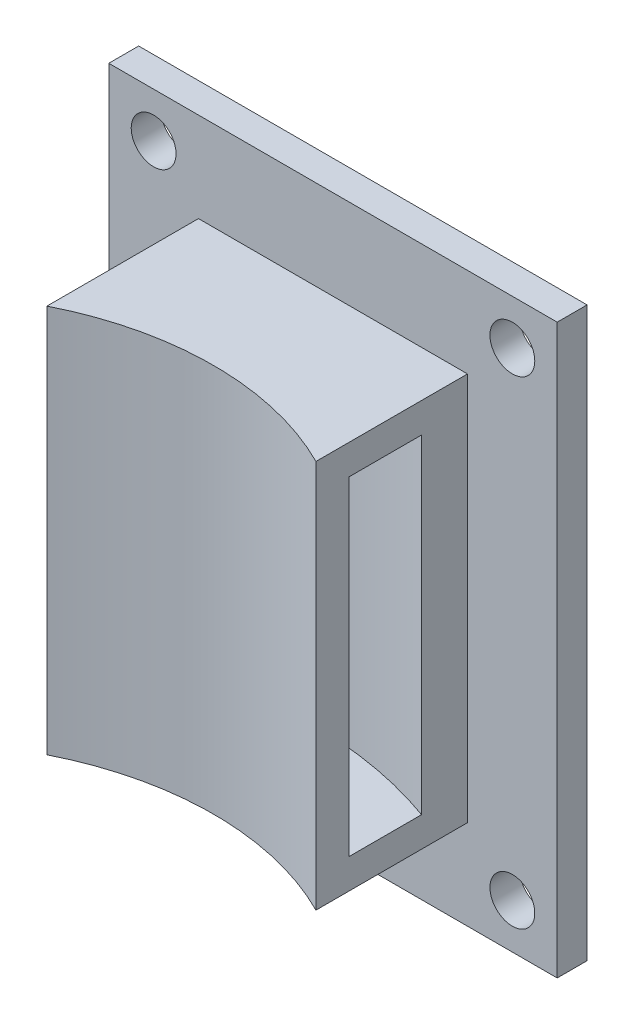
ISO-10303-21;
HEADER;
FILE_DESCRIPTION(('STEP AP214'),'2;1');
FILE_NAME('part.step','',(''),(''),'','','');
FILE_SCHEMA(('AUTOMOTIVE_DESIGN { 1 0 10303 214 1 1 1 1 }'));
ENDSEC;
DATA;
#1=APPLICATION_CONTEXT('core data for automotive mechanical design processes');
#2=APPLICATION_PROTOCOL_DEFINITION('international standard','automotive_design',2000,#1);
#3=PRODUCT_CONTEXT('',#1,'mechanical');
#4=PRODUCT('Part','Part','',(#3));
#5=PRODUCT_RELATED_PRODUCT_CATEGORY('part','',(#4));
#6=PRODUCT_DEFINITION_FORMATION('','',#4);
#7=PRODUCT_DEFINITION_CONTEXT('part definition',#1,'design');
#8=PRODUCT_DEFINITION('design','',#6,#7);
#9=PRODUCT_DEFINITION_SHAPE('','',#8);
#10=(LENGTH_UNIT() NAMED_UNIT(*) SI_UNIT(.MILLI.,.METRE.));
#11=(NAMED_UNIT(*) PLANE_ANGLE_UNIT() SI_UNIT($,.RADIAN.));
#12=(NAMED_UNIT(*) SI_UNIT($,.STERADIAN.) SOLID_ANGLE_UNIT());
#13=UNCERTAINTY_MEASURE_WITH_UNIT(LENGTH_MEASURE(1.E-05),#10,'distance_accuracy_value','');
#14=(GEOMETRIC_REPRESENTATION_CONTEXT(3) GLOBAL_UNCERTAINTY_ASSIGNED_CONTEXT((#13)) GLOBAL_UNIT_ASSIGNED_CONTEXT((#10,
#11,#12)) REPRESENTATION_CONTEXT('',''));
#15=CARTESIAN_POINT('',(0.,0.,0.));
#16=DIRECTION('',(0.,0.,1.));
#17=DIRECTION('',(1.,0.,0.));
#18=AXIS2_PLACEMENT_3D('',#15,#16,#17);
#19=CARTESIAN_POINT('',(-9.,11.,-30.));
#20=DIRECTION('',(1.,0.,0.));
#21=DIRECTION('',(0.,0.,-1.));
#22=AXIS2_PLACEMENT_3D('',#19,#20,#21);
#23=PLANE('',#22);
#24=DIRECTION('',(0.,0.,1.));
#25=VECTOR('',#24,1.);
#26=CARTESIAN_POINT('',(-9.,-11.,-30.));
#27=LINE('',#26,#25);
#28=CARTESIAN_POINT('',(-9.,-11.,-24.924887161229));
#29=VERTEX_POINT('',#28);
#30=CARTESIAN_POINT('',(-9.,-11.,-20.0748598998847));
#31=VERTEX_POINT('',#30);
#32=EDGE_CURVE('E189',#29,#31,#27,.T.);
#33=ORIENTED_EDGE('',*,*,#32,.F.);
#34=DIRECTION('',(0.,-1.,0.));
#35=VECTOR('',#34,1.);
#36=CARTESIAN_POINT('',(-9.,11.,-24.924887161229));
#37=LINE('',#36,#35);
#38=CARTESIAN_POINT('',(-9.,11.,-24.924887161229));
#39=VERTEX_POINT('',#38);
#40=EDGE_CURVE('E11',#39,#29,#37,.T.);
#41=ORIENTED_EDGE('',*,*,#40,.F.);
#42=DIRECTION('',(0.,0.,1.));
#43=VECTOR('',#42,1.);
#44=CARTESIAN_POINT('',(-9.,11.,-30.));
#45=LINE('',#44,#43);
#46=CARTESIAN_POINT('',(-9.,11.,-20.0748598998847));
#47=VERTEX_POINT('',#46);
#48=EDGE_CURVE('E150',#39,#47,#45,.T.);
#49=ORIENTED_EDGE('',*,*,#48,.T.);
#50=DIRECTION('',(0.,-1.,0.));
#51=VECTOR('',#50,1.);
#52=CARTESIAN_POINT('',(-9.,11.,-20.0748598998847));
#53=LINE('',#52,#51);
#54=EDGE_CURVE('E188',#47,#31,#53,.T.);
#55=ORIENTED_EDGE('',*,*,#54,.T.);
#56=EDGE_LOOP('',(#33,#41,#49,#55));
#57=FACE_BOUND('',#56,.T.);
#58=DIRECTION('',(0.,1.,0.));
#59=VECTOR('',#58,1.);
#60=CARTESIAN_POINT('',(-9.,-13.,-28.));
#61=LINE('',#60,#59);
#62=CARTESIAN_POINT('',(-9.,-13.,-28.));
#63=VERTEX_POINT('',#62);
#64=CARTESIAN_POINT('',(-9.,13.,-28.));
#65=VERTEX_POINT('',#64);
#66=EDGE_CURVE('E130',#63,#65,#61,.T.);
#67=ORIENTED_EDGE('',*,*,#66,.F.);
#68=DIRECTION('',(0.,0.,1.));
#69=VECTOR('',#68,1.);
#70=CARTESIAN_POINT('',(-9.,-13.,-30.));
#71=LINE('',#70,#69);
#72=CARTESIAN_POINT('',(-8.99999999999999,-13.,-17.8605710994918));
#73=VERTEX_POINT('',#72);
#74=EDGE_CURVE('E194',#63,#73,#71,.T.);
#75=ORIENTED_EDGE('',*,*,#74,.T.);
#76=DIRECTION('',(0.,-1.,0.));
#77=VECTOR('',#76,1.);
#78=CARTESIAN_POINT('',(-8.99999999999999,13.,-17.8605710994918));
#79=LINE('',#78,#77);
#80=CARTESIAN_POINT('',(-8.99999999999999,13.,-17.8605710994918));
#81=VERTEX_POINT('',#80);
#82=EDGE_CURVE('E164',#81,#73,#79,.T.);
#83=ORIENTED_EDGE('',*,*,#82,.F.);
#84=DIRECTION('',(0.,0.,1.));
#85=VECTOR('',#84,1.);
#86=CARTESIAN_POINT('',(-9.,13.,-30.));
#87=LINE('',#86,#85);
#88=EDGE_CURVE('E149',#65,#81,#87,.T.);
#89=ORIENTED_EDGE('',*,*,#88,.F.);
#90=EDGE_LOOP('',(#67,#75,#83,#89));
#91=FACE_BOUND('',#90,.T.);
#92=ADVANCED_FACE('F39',(#57,#91),#23,.F.);
#93=CARTESIAN_POINT('',(9.,11.,-30.));
#94=DIRECTION('',(-1.,0.,0.));
#95=DIRECTION('',(0.,0.,1.));
#96=AXIS2_PLACEMENT_3D('',#93,#94,#95);
#97=PLANE('',#96);
#98=DIRECTION('',(0.,-1.,0.));
#99=VECTOR('',#98,1.);
#100=CARTESIAN_POINT('',(9.,11.,-24.924887161229));
#101=LINE('',#100,#99);
#102=CARTESIAN_POINT('',(9.,11.,-24.924887161229));
#103=VERTEX_POINT('',#102);
#104=CARTESIAN_POINT('',(9.,-11.,-24.924887161229));
#105=VERTEX_POINT('',#104);
#106=EDGE_CURVE('E47',#103,#105,#101,.T.);
#107=ORIENTED_EDGE('',*,*,#106,.T.);
#108=DIRECTION('',(0.,0.,-1.));
#109=VECTOR('',#108,1.);
#110=CARTESIAN_POINT('',(9.,-11.,-17.8605710994918));
#111=LINE('',#110,#109);
#112=CARTESIAN_POINT('',(9.,-11.,-20.0748598998847));
#113=VERTEX_POINT('',#112);
#114=EDGE_CURVE('E176',#113,#105,#111,.T.);
#115=ORIENTED_EDGE('',*,*,#114,.F.);
#116=DIRECTION('',(0.,-1.,0.));
#117=VECTOR('',#116,1.);
#118=CARTESIAN_POINT('',(9.,11.,-20.0748598998847));
#119=LINE('',#118,#117);
#120=CARTESIAN_POINT('',(9.,11.,-20.0748598998847));
#121=VERTEX_POINT('',#120);
#122=EDGE_CURVE('E192',#121,#113,#119,.T.);
#123=ORIENTED_EDGE('',*,*,#122,.F.);
#124=DIRECTION('',(0.,0.,-1.));
#125=VECTOR('',#124,1.);
#126=CARTESIAN_POINT('',(9.,11.,-17.8605710994918));
#127=LINE('',#126,#125);
#128=EDGE_CURVE('E153',#121,#103,#127,.T.);
#129=ORIENTED_EDGE('',*,*,#128,.T.);
#130=EDGE_LOOP('',(#107,#115,#123,#129));
#131=FACE_BOUND('',#130,.T.);
#132=DIRECTION('',(0.,-1.,0.));
#133=VECTOR('',#132,1.);
#134=CARTESIAN_POINT('',(9.,13.,-28.));
#135=LINE('',#134,#133);
#136=CARTESIAN_POINT('',(9.,13.,-28.));
#137=VERTEX_POINT('',#136);
#138=CARTESIAN_POINT('',(9.,-13.,-28.));
#139=VERTEX_POINT('',#138);
#140=EDGE_CURVE('E54',#137,#139,#135,.T.);
#141=ORIENTED_EDGE('',*,*,#140,.F.);
#142=DIRECTION('',(0.,0.,-1.));
#143=VECTOR('',#142,1.);
#144=CARTESIAN_POINT('',(9.,13.,-17.8605710994918));
#145=LINE('',#144,#143);
#146=CARTESIAN_POINT('',(9.,13.,-17.8605710994918));
#147=VERTEX_POINT('',#146);
#148=EDGE_CURVE('E140',#147,#137,#145,.T.);
#149=ORIENTED_EDGE('',*,*,#148,.F.);
#150=DIRECTION('',(0.,-1.,0.));
#151=VECTOR('',#150,1.);
#152=CARTESIAN_POINT('',(9.,13.,-17.8605710994918));
#153=LINE('',#152,#151);
#154=CARTESIAN_POINT('',(9.,-13.,-17.8605710994918));
#155=VERTEX_POINT('',#154);
#156=EDGE_CURVE('E160',#147,#155,#153,.T.);
#157=ORIENTED_EDGE('',*,*,#156,.T.);
#158=DIRECTION('',(0.,0.,-1.));
#159=VECTOR('',#158,1.);
#160=CARTESIAN_POINT('',(9.,-13.,-17.8605710994918));
#161=LINE('',#160,#159);
#162=EDGE_CURVE('E142',#155,#139,#161,.T.);
#163=ORIENTED_EDGE('',*,*,#162,.T.);
#164=EDGE_LOOP('',(#141,#149,#157,#163));
#165=FACE_BOUND('',#164,.T.);
#166=ADVANCED_FACE('F139',(#131,#165),#97,.F.);
#167=CARTESIAN_POINT('',(0.,13.,0.));
#168=DIRECTION('',(0.,1.,0.));
#169=DIRECTION('',(0.,0.,1.));
#170=AXIS2_PLACEMENT_3D('',#167,#168,#169);
#171=PLANE('',#170);
#172=ORIENTED_EDGE('',*,*,#148,.T.);
#173=DIRECTION('',(1.,0.,0.));
#174=VECTOR('',#173,1.);
#175=CARTESIAN_POINT('',(-9.,13.,-28.));
#176=LINE('',#175,#174);
#177=EDGE_CURVE('E126',#65,#137,#176,.T.);
#178=ORIENTED_EDGE('',*,*,#177,.F.);
#179=ORIENTED_EDGE('',*,*,#88,.T.);
#180=CARTESIAN_POINT('',(0.,13.,0.));
#181=DIRECTION('',(0.,-1.,0.));
#182=DIRECTION('',(0.,0.,1.));
#183=AXIS2_PLACEMENT_3D('',#180,#181,#182);
#184=CIRCLE('',#183,20.);
#185=EDGE_CURVE('E147',#81,#147,#184,.T.);
#186=ORIENTED_EDGE('',*,*,#185,.T.);
#187=EDGE_LOOP('',(#172,#178,#179,#186));
#188=FACE_BOUND('',#187,.T.);
#189=ADVANCED_FACE('F145',(#188),#171,.T.);
#190=CARTESIAN_POINT('',(0.,-13.,0.));
#191=DIRECTION('',(0.,-1.,0.));
#192=DIRECTION('',(0.,0.,1.));
#193=AXIS2_PLACEMENT_3D('',#190,#191,#192);
#194=PLANE('',#193);
#195=ORIENTED_EDGE('',*,*,#74,.F.);
#196=DIRECTION('',(-1.,0.,0.));
#197=VECTOR('',#196,1.);
#198=CARTESIAN_POINT('',(9.,-13.,-28.));
#199=LINE('',#198,#197);
#200=EDGE_CURVE('E143',#139,#63,#199,.T.);
#201=ORIENTED_EDGE('',*,*,#200,.F.);
#202=ORIENTED_EDGE('',*,*,#162,.F.);
#203=CARTESIAN_POINT('',(0.,-13.,0.));
#204=DIRECTION('',(0.,-1.,0.));
#205=DIRECTION('',(0.,0.,1.));
#206=AXIS2_PLACEMENT_3D('',#203,#204,#205);
#207=CIRCLE('',#206,20.);
#208=EDGE_CURVE('E200',#73,#155,#207,.T.);
#209=ORIENTED_EDGE('',*,*,#208,.F.);
#210=EDGE_LOOP('',(#195,#201,#202,#209));
#211=FACE_BOUND('',#210,.T.);
#212=ADVANCED_FACE('F303',(#211),#194,.T.);
#213=CARTESIAN_POINT('',(0.,11.,0.));
#214=DIRECTION('',(0.,1.,0.));
#215=DIRECTION('',(0.,0.,1.));
#216=AXIS2_PLACEMENT_3D('',#213,#214,#215);
#217=PLANE('',#216);
#218=CARTESIAN_POINT('',(0.,11.,0.));
#219=DIRECTION('',(0.,1.,0.));
#220=DIRECTION('',(0.,0.,1.));
#221=AXIS2_PLACEMENT_3D('',#218,#219,#220);
#222=CIRCLE('',#221,22.);
#223=EDGE_CURVE('E156',#121,#47,#222,.T.);
#224=ORIENTED_EDGE('',*,*,#223,.T.);
#225=ORIENTED_EDGE('',*,*,#48,.F.);
#226=CARTESIAN_POINT('',(0.,11.,0.));
#227=DIRECTION('',(0.,-1.,0.));
#228=DIRECTION('',(0.,0.,1.));
#229=AXIS2_PLACEMENT_3D('',#226,#227,#228);
#230=CIRCLE('',#229,26.5);
#231=EDGE_CURVE('E168',#39,#103,#230,.T.);
#232=ORIENTED_EDGE('',*,*,#231,.T.);
#233=ORIENTED_EDGE('',*,*,#128,.F.);
#234=EDGE_LOOP('',(#224,#225,#232,#233));
#235=FACE_BOUND('',#234,.T.);
#236=ADVANCED_FACE('F184',(#235),#217,.F.);
#237=CARTESIAN_POINT('',(0.,11.,0.));
#238=DIRECTION('',(0.,-1.,0.));
#239=DIRECTION('',(0.,0.,-1.));
#240=AXIS2_PLACEMENT_3D('',#237,#238,#239);
#241=CYLINDRICAL_SURFACE('',#240,26.5);
#242=CARTESIAN_POINT('',(0.,-11.,0.));
#243=DIRECTION('',(0.,-1.,0.));
#244=DIRECTION('',(0.,0.,1.));
#245=AXIS2_PLACEMENT_3D('',#242,#243,#244);
#246=CIRCLE('',#245,26.5);
#247=EDGE_CURVE('E167',#29,#105,#246,.T.);
#248=ORIENTED_EDGE('',*,*,#247,.T.);
#249=ORIENTED_EDGE('',*,*,#106,.F.);
#250=ORIENTED_EDGE('',*,*,#231,.F.);
#251=ORIENTED_EDGE('',*,*,#40,.T.);
#252=EDGE_LOOP('',(#248,#249,#250,#251));
#253=FACE_BOUND('',#252,.T.);
#254=ADVANCED_FACE('F180',(#253),#241,.F.);
#255=CARTESIAN_POINT('',(0.,13.,0.));
#256=DIRECTION('',(0.,-1.,0.));
#257=DIRECTION('',(0.,0.,-1.));
#258=AXIS2_PLACEMENT_3D('',#255,#256,#257);
#259=CYLINDRICAL_SURFACE('',#258,20.);
#260=ORIENTED_EDGE('',*,*,#82,.T.);
#261=ORIENTED_EDGE('',*,*,#208,.T.);
#262=ORIENTED_EDGE('',*,*,#156,.F.);
#263=ORIENTED_EDGE('',*,*,#185,.F.);
#264=EDGE_LOOP('',(#260,#261,#262,#263));
#265=FACE_BOUND('',#264,.T.);
#266=ADVANCED_FACE('F296',(#265),#259,.F.);
#267=CARTESIAN_POINT('',(0.,11.,0.));
#268=DIRECTION('',(0.,-1.,0.));
#269=DIRECTION('',(0.,0.,-1.));
#270=AXIS2_PLACEMENT_3D('',#267,#268,#269);
#271=CYLINDRICAL_SURFACE('',#270,22.);
#272=CARTESIAN_POINT('',(0.,-11.,0.));
#273=DIRECTION('',(0.,1.,0.));
#274=DIRECTION('',(0.,0.,1.));
#275=AXIS2_PLACEMENT_3D('',#272,#273,#274);
#276=CIRCLE('',#275,22.);
#277=EDGE_CURVE('E161',#113,#31,#276,.T.);
#278=ORIENTED_EDGE('',*,*,#277,.T.);
#279=ORIENTED_EDGE('',*,*,#54,.F.);
#280=ORIENTED_EDGE('',*,*,#223,.F.);
#281=ORIENTED_EDGE('',*,*,#122,.T.);
#282=EDGE_LOOP('',(#278,#279,#280,#281));
#283=FACE_BOUND('',#282,.T.);
#284=ADVANCED_FACE('F197',(#283),#271,.T.);
#285=CARTESIAN_POINT('',(0.,-11.,0.));
#286=DIRECTION('',(0.,-1.,0.));
#287=DIRECTION('',(0.,0.,1.));
#288=AXIS2_PLACEMENT_3D('',#285,#286,#287);
#289=PLANE('',#288);
#290=ORIENTED_EDGE('',*,*,#114,.T.);
#291=ORIENTED_EDGE('',*,*,#247,.F.);
#292=ORIENTED_EDGE('',*,*,#32,.T.);
#293=ORIENTED_EDGE('',*,*,#277,.F.);
#294=EDGE_LOOP('',(#290,#291,#292,#293));
#295=FACE_BOUND('',#294,.T.);
#296=ADVANCED_FACE('F199',(#295),#289,.F.);
#297=CARTESIAN_POINT('',(-15.,19.,-28.));
#298=DIRECTION('',(0.,1.,0.));
#299=DIRECTION('',(0.,0.,1.));
#300=AXIS2_PLACEMENT_3D('',#297,#298,#299);
#301=PLANE('',#300);
#302=DIRECTION('',(1.,0.,0.));
#303=VECTOR('',#302,1.);
#304=CARTESIAN_POINT('',(-15.,19.,-30.));
#305=LINE('',#304,#303);
#306=CARTESIAN_POINT('',(-15.,19.,-30.));
#307=VERTEX_POINT('',#306);
#308=CARTESIAN_POINT('',(15.,19.,-30.));
#309=VERTEX_POINT('',#308);
#310=EDGE_CURVE('E226',#307,#309,#305,.T.);
#311=ORIENTED_EDGE('',*,*,#310,.F.);
#312=DIRECTION('',(0.,0.,-1.));
#313=VECTOR('',#312,1.);
#314=CARTESIAN_POINT('',(-15.,19.,-28.));
#315=LINE('',#314,#313);
#316=CARTESIAN_POINT('',(-15.,19.,-28.));
#317=VERTEX_POINT('',#316);
#318=EDGE_CURVE('E202',#317,#307,#315,.T.);
#319=ORIENTED_EDGE('',*,*,#318,.F.);
#320=DIRECTION('',(1.,0.,0.));
#321=VECTOR('',#320,1.);
#322=CARTESIAN_POINT('',(-15.,19.,-28.));
#323=LINE('',#322,#321);
#324=CARTESIAN_POINT('',(15.,19.,-28.));
#325=VERTEX_POINT('',#324);
#326=EDGE_CURVE('E219',#317,#325,#323,.T.);
#327=ORIENTED_EDGE('',*,*,#326,.T.);
#328=DIRECTION('',(0.,0.,-1.));
#329=VECTOR('',#328,1.);
#330=CARTESIAN_POINT('',(15.,19.,-28.));
#331=LINE('',#330,#329);
#332=EDGE_CURVE('E208',#325,#309,#331,.T.);
#333=ORIENTED_EDGE('',*,*,#332,.T.);
#334=EDGE_LOOP('',(#311,#319,#327,#333));
#335=FACE_BOUND('',#334,.T.);
#336=ADVANCED_FACE('F309',(#335),#301,.T.);
#337=CARTESIAN_POINT('',(-15.,-19.,-28.));
#338=DIRECTION('',(-1.,0.,0.));
#339=DIRECTION('',(0.,0.,1.));
#340=AXIS2_PLACEMENT_3D('',#337,#338,#339);
#341=PLANE('',#340);
#342=DIRECTION('',(0.,1.,0.));
#343=VECTOR('',#342,1.);
#344=CARTESIAN_POINT('',(-15.,-19.,-30.));
#345=LINE('',#344,#343);
#346=CARTESIAN_POINT('',(-15.,-19.,-30.));
#347=VERTEX_POINT('',#346);
#348=EDGE_CURVE('E216',#347,#307,#345,.T.);
#349=ORIENTED_EDGE('',*,*,#348,.F.);
#350=DIRECTION('',(0.,0.,-1.));
#351=VECTOR('',#350,1.);
#352=CARTESIAN_POINT('',(-15.,-19.,-28.));
#353=LINE('',#352,#351);
#354=CARTESIAN_POINT('',(-15.,-19.,-28.));
#355=VERTEX_POINT('',#354);
#356=EDGE_CURVE('E213',#355,#347,#353,.T.);
#357=ORIENTED_EDGE('',*,*,#356,.F.);
#358=DIRECTION('',(0.,1.,0.));
#359=VECTOR('',#358,1.);
#360=CARTESIAN_POINT('',(-15.,-19.,-28.));
#361=LINE('',#360,#359);
#362=EDGE_CURVE('E211',#355,#317,#361,.T.);
#363=ORIENTED_EDGE('',*,*,#362,.T.);
#364=ORIENTED_EDGE('',*,*,#318,.T.);
#365=EDGE_LOOP('',(#349,#357,#363,#364));
#366=FACE_BOUND('',#365,.T.);
#367=ADVANCED_FACE('F315',(#366),#341,.T.);
#368=CARTESIAN_POINT('',(15.,-19.,-28.));
#369=DIRECTION('',(0.,-1.,0.));
#370=DIRECTION('',(0.,0.,-1.));
#371=AXIS2_PLACEMENT_3D('',#368,#369,#370);
#372=PLANE('',#371);
#373=DIRECTION('',(-1.,0.,0.));
#374=VECTOR('',#373,1.);
#375=CARTESIAN_POINT('',(15.,-19.,-30.));
#376=LINE('',#375,#374);
#377=CARTESIAN_POINT('',(15.,-19.,-30.));
#378=VERTEX_POINT('',#377);
#379=EDGE_CURVE('E220',#378,#347,#376,.T.);
#380=ORIENTED_EDGE('',*,*,#379,.F.);
#381=DIRECTION('',(0.,0.,-1.));
#382=VECTOR('',#381,1.);
#383=CARTESIAN_POINT('',(15.,-19.,-28.));
#384=LINE('',#383,#382);
#385=CARTESIAN_POINT('',(15.,-19.,-28.));
#386=VERTEX_POINT('',#385);
#387=EDGE_CURVE('E210',#386,#378,#384,.T.);
#388=ORIENTED_EDGE('',*,*,#387,.F.);
#389=DIRECTION('',(-1.,0.,0.));
#390=VECTOR('',#389,1.);
#391=CARTESIAN_POINT('',(15.,-19.,-28.));
#392=LINE('',#391,#390);
#393=EDGE_CURVE('E231',#386,#355,#392,.T.);
#394=ORIENTED_EDGE('',*,*,#393,.T.);
#395=ORIENTED_EDGE('',*,*,#356,.T.);
#396=EDGE_LOOP('',(#380,#388,#394,#395));
#397=FACE_BOUND('',#396,.T.);
#398=ADVANCED_FACE('F319',(#397),#372,.T.);
#399=CARTESIAN_POINT('',(15.,19.,-28.));
#400=DIRECTION('',(1.,0.,0.));
#401=DIRECTION('',(0.,0.,-1.));
#402=AXIS2_PLACEMENT_3D('',#399,#400,#401);
#403=PLANE('',#402);
#404=DIRECTION('',(0.,-1.,0.));
#405=VECTOR('',#404,1.);
#406=CARTESIAN_POINT('',(15.,19.,-30.));
#407=LINE('',#406,#405);
#408=EDGE_CURVE('E223',#309,#378,#407,.T.);
#409=ORIENTED_EDGE('',*,*,#408,.F.);
#410=ORIENTED_EDGE('',*,*,#332,.F.);
#411=DIRECTION('',(0.,-1.,0.));
#412=VECTOR('',#411,1.);
#413=CARTESIAN_POINT('',(15.,19.,-28.));
#414=LINE('',#413,#412);
#415=EDGE_CURVE('E234',#325,#386,#414,.T.);
#416=ORIENTED_EDGE('',*,*,#415,.T.);
#417=ORIENTED_EDGE('',*,*,#387,.T.);
#418=EDGE_LOOP('',(#409,#410,#416,#417));
#419=FACE_BOUND('',#418,.T.);
#420=ADVANCED_FACE('F269',(#419),#403,.T.);
#421=CARTESIAN_POINT('',(0.,0.,-28.));
#422=DIRECTION('',(0.,0.,-1.));
#423=DIRECTION('',(-1.,0.,0.));
#424=AXIS2_PLACEMENT_3D('',#421,#422,#423);
#425=PLANE('',#424);
#426=CARTESIAN_POINT('',(-12.,16.,-28.));
#427=DIRECTION('',(0.,0.,1.));
#428=DIRECTION('',(-1.,0.,0.));
#429=AXIS2_PLACEMENT_3D('',#426,#427,#428);
#430=CIRCLE('',#429,1.5);
#431=CARTESIAN_POINT('',(-13.5,16.,-28.));
#432=VERTEX_POINT('',#431);
#433=EDGE_CURVE('E244',#432,#432,#430,.T.);
#434=ORIENTED_EDGE('',*,*,#433,.F.);
#435=EDGE_LOOP('',(#434));
#436=FACE_BOUND('',#435,.T.);
#437=CARTESIAN_POINT('',(12.,-16.,-28.));
#438=DIRECTION('',(0.,0.,1.));
#439=DIRECTION('',(-1.,0.,0.));
#440=AXIS2_PLACEMENT_3D('',#437,#438,#439);
#441=CIRCLE('',#440,1.5);
#442=CARTESIAN_POINT('',(10.5,-16.,-28.));
#443=VERTEX_POINT('',#442);
#444=EDGE_CURVE('E250',#443,#443,#441,.T.);
#445=ORIENTED_EDGE('',*,*,#444,.F.);
#446=EDGE_LOOP('',(#445));
#447=FACE_BOUND('',#446,.T.);
#448=CARTESIAN_POINT('',(-12.,-16.,-28.));
#449=DIRECTION('',(0.,0.,1.));
#450=DIRECTION('',(1.,0.,0.));
#451=AXIS2_PLACEMENT_3D('',#448,#449,#450);
#452=CIRCLE('',#451,1.5);
#453=CARTESIAN_POINT('',(-10.5,-16.,-28.));
#454=VERTEX_POINT('',#453);
#455=EDGE_CURVE('E251',#454,#454,#452,.T.);
#456=ORIENTED_EDGE('',*,*,#455,.F.);
#457=EDGE_LOOP('',(#456));
#458=FACE_BOUND('',#457,.T.);
#459=CARTESIAN_POINT('',(12.,16.,-28.));
#460=DIRECTION('',(0.,0.,1.));
#461=DIRECTION('',(1.,0.,0.));
#462=AXIS2_PLACEMENT_3D('',#459,#460,#461);
#463=CIRCLE('',#462,1.5);
#464=CARTESIAN_POINT('',(13.5,16.,-28.));
#465=VERTEX_POINT('',#464);
#466=EDGE_CURVE('E241',#465,#465,#463,.T.);
#467=ORIENTED_EDGE('',*,*,#466,.F.);
#468=EDGE_LOOP('',(#467));
#469=FACE_BOUND('',#468,.T.);
#470=ORIENTED_EDGE('',*,*,#66,.T.);
#471=ORIENTED_EDGE('',*,*,#177,.T.);
#472=ORIENTED_EDGE('',*,*,#140,.T.);
#473=ORIENTED_EDGE('',*,*,#200,.T.);
#474=EDGE_LOOP('',(#470,#471,#472,#473));
#475=FACE_BOUND('',#474,.T.);
#476=ORIENTED_EDGE('',*,*,#326,.F.);
#477=ORIENTED_EDGE('',*,*,#362,.F.);
#478=ORIENTED_EDGE('',*,*,#393,.F.);
#479=ORIENTED_EDGE('',*,*,#415,.F.);
#480=EDGE_LOOP('',(#476,#477,#478,#479));
#481=FACE_BOUND('',#480,.T.);
#482=ADVANCED_FACE('F127',(#436,#447,#458,#469,#475,#481),#425,.F.);
#483=CARTESIAN_POINT('',(-9.,11.,-30.));
#484=DIRECTION('',(0.,0.,1.));
#485=DIRECTION('',(1.,0.,0.));
#486=AXIS2_PLACEMENT_3D('',#483,#484,#485);
#487=PLANE('',#486);
#488=CARTESIAN_POINT('',(-12.,16.,-30.));
#489=DIRECTION('',(0.,0.,1.));
#490=DIRECTION('',(-1.,0.,0.));
#491=AXIS2_PLACEMENT_3D('',#488,#489,#490);
#492=CIRCLE('',#491,1.5);
#493=CARTESIAN_POINT('',(-13.5,16.,-30.));
#494=VERTEX_POINT('',#493);
#495=EDGE_CURVE('E254',#494,#494,#492,.T.);
#496=ORIENTED_EDGE('',*,*,#495,.T.);
#497=EDGE_LOOP('',(#496));
#498=FACE_BOUND('',#497,.T.);
#499=CARTESIAN_POINT('',(12.,-16.,-30.));
#500=DIRECTION('',(0.,0.,1.));
#501=DIRECTION('',(-1.,0.,0.));
#502=AXIS2_PLACEMENT_3D('',#499,#500,#501);
#503=CIRCLE('',#502,1.5);
#504=CARTESIAN_POINT('',(10.5,-16.,-30.));
#505=VERTEX_POINT('',#504);
#506=EDGE_CURVE('E247',#505,#505,#503,.T.);
#507=ORIENTED_EDGE('',*,*,#506,.T.);
#508=EDGE_LOOP('',(#507));
#509=FACE_BOUND('',#508,.T.);
#510=CARTESIAN_POINT('',(-12.,-16.,-30.));
#511=DIRECTION('',(0.,0.,1.));
#512=DIRECTION('',(1.,0.,0.));
#513=AXIS2_PLACEMENT_3D('',#510,#511,#512);
#514=CIRCLE('',#513,1.5);
#515=CARTESIAN_POINT('',(-10.5,-16.,-30.));
#516=VERTEX_POINT('',#515);
#517=EDGE_CURVE('E259',#516,#516,#514,.T.);
#518=ORIENTED_EDGE('',*,*,#517,.T.);
#519=EDGE_LOOP('',(#518));
#520=FACE_BOUND('',#519,.T.);
#521=CARTESIAN_POINT('',(12.,16.,-30.));
#522=DIRECTION('',(0.,0.,1.));
#523=DIRECTION('',(1.,0.,0.));
#524=AXIS2_PLACEMENT_3D('',#521,#522,#523);
#525=CIRCLE('',#524,1.5);
#526=CARTESIAN_POINT('',(13.5,16.,-30.));
#527=VERTEX_POINT('',#526);
#528=EDGE_CURVE('E134',#527,#527,#525,.T.);
#529=ORIENTED_EDGE('',*,*,#528,.T.);
#530=EDGE_LOOP('',(#529));
#531=FACE_BOUND('',#530,.T.);
#532=ORIENTED_EDGE('',*,*,#310,.T.);
#533=ORIENTED_EDGE('',*,*,#408,.T.);
#534=ORIENTED_EDGE('',*,*,#379,.T.);
#535=ORIENTED_EDGE('',*,*,#348,.T.);
#536=EDGE_LOOP('',(#532,#533,#534,#535));
#537=FACE_BOUND('',#536,.T.);
#538=ADVANCED_FACE('F41',(#498,#509,#520,#531,#537),#487,.F.);
#539=CARTESIAN_POINT('',(12.,16.,-30.));
#540=DIRECTION('',(0.,0.,1.));
#541=DIRECTION('',(1.,0.,0.));
#542=AXIS2_PLACEMENT_3D('',#539,#540,#541);
#543=CYLINDRICAL_SURFACE('',#542,1.5);
#544=ORIENTED_EDGE('',*,*,#528,.F.);
#545=EDGE_LOOP('',(#544));
#546=FACE_BOUND('',#545,.T.);
#547=ORIENTED_EDGE('',*,*,#466,.T.);
#548=EDGE_LOOP('',(#547));
#549=FACE_BOUND('',#548,.T.);
#550=ADVANCED_FACE('F274',(#546,#549),#543,.F.);
#551=CARTESIAN_POINT('',(-12.,-16.,-30.));
#552=DIRECTION('',(0.,0.,1.));
#553=DIRECTION('',(1.,0.,0.));
#554=AXIS2_PLACEMENT_3D('',#551,#552,#553);
#555=CYLINDRICAL_SURFACE('',#554,1.5);
#556=ORIENTED_EDGE('',*,*,#517,.F.);
#557=EDGE_LOOP('',(#556));
#558=FACE_BOUND('',#557,.T.);
#559=ORIENTED_EDGE('',*,*,#455,.T.);
#560=EDGE_LOOP('',(#559));
#561=FACE_BOUND('',#560,.T.);
#562=ADVANCED_FACE('F265',(#558,#561),#555,.F.);
#563=CARTESIAN_POINT('',(12.,-16.,-30.));
#564=DIRECTION('',(0.,0.,1.));
#565=DIRECTION('',(1.,0.,0.));
#566=AXIS2_PLACEMENT_3D('',#563,#564,#565);
#567=CYLINDRICAL_SURFACE('',#566,1.5);
#568=ORIENTED_EDGE('',*,*,#506,.F.);
#569=EDGE_LOOP('',(#568));
#570=FACE_BOUND('',#569,.T.);
#571=ORIENTED_EDGE('',*,*,#444,.T.);
#572=EDGE_LOOP('',(#571));
#573=FACE_BOUND('',#572,.T.);
#574=ADVANCED_FACE('F282',(#570,#573),#567,.F.);
#575=CARTESIAN_POINT('',(-12.,16.,-30.));
#576=DIRECTION('',(0.,0.,1.));
#577=DIRECTION('',(1.,0.,0.));
#578=AXIS2_PLACEMENT_3D('',#575,#576,#577);
#579=CYLINDRICAL_SURFACE('',#578,1.5);
#580=ORIENTED_EDGE('',*,*,#495,.F.);
#581=EDGE_LOOP('',(#580));
#582=FACE_BOUND('',#581,.T.);
#583=ORIENTED_EDGE('',*,*,#433,.T.);
#584=EDGE_LOOP('',(#583));
#585=FACE_BOUND('',#584,.T.);
#586=ADVANCED_FACE('F383',(#582,#585),#579,.F.);
#587=CLOSED_SHELL('',(#92,#166,#189,#212,#236,#254,#266,#284,#296,#336,#367,#398,#420,#482,#538,
#550,#562,#574,#586));
#588=MANIFOLD_SOLID_BREP('B2',#587);
#589=ADVANCED_BREP_SHAPE_REPRESENTATION('',(#18,#588),#14);
#590=SHAPE_DEFINITION_REPRESENTATION(#9,#589);
ENDSEC;
END-ISO-10303-21;
